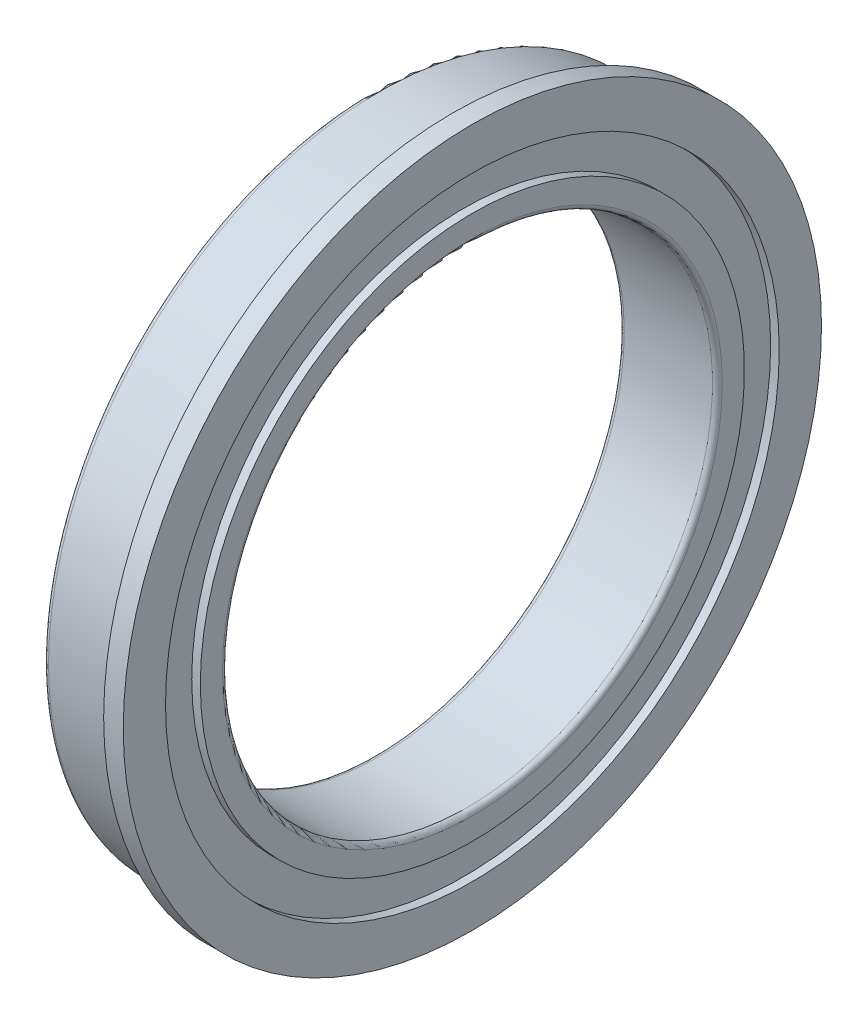
ISO-10303-21;
HEADER;
FILE_DESCRIPTION(('STEP AP214'),'2;1');
FILE_NAME('part.step','',(''),(''),'','','');
FILE_SCHEMA(('AUTOMOTIVE_DESIGN { 1 0 10303 214 1 1 1 1 }'));
ENDSEC;
DATA;
#1=APPLICATION_CONTEXT('core data for automotive mechanical design processes');
#2=APPLICATION_PROTOCOL_DEFINITION('international standard','automotive_design',2000,#1);
#3=PRODUCT_CONTEXT('',#1,'mechanical');
#4=PRODUCT('Part','Part','',(#3));
#5=PRODUCT_RELATED_PRODUCT_CATEGORY('part','',(#4));
#6=PRODUCT_DEFINITION_FORMATION('','',#4);
#7=PRODUCT_DEFINITION_CONTEXT('part definition',#1,'design');
#8=PRODUCT_DEFINITION('design','',#6,#7);
#9=PRODUCT_DEFINITION_SHAPE('','',#8);
#10=(LENGTH_UNIT() NAMED_UNIT(*) SI_UNIT(.MILLI.,.METRE.));
#11=(NAMED_UNIT(*) PLANE_ANGLE_UNIT() SI_UNIT($,.RADIAN.));
#12=(NAMED_UNIT(*) SI_UNIT($,.STERADIAN.) SOLID_ANGLE_UNIT());
#13=UNCERTAINTY_MEASURE_WITH_UNIT(LENGTH_MEASURE(1.E-05),#10,'distance_accuracy_value','');
#14=(GEOMETRIC_REPRESENTATION_CONTEXT(3) GLOBAL_UNCERTAINTY_ASSIGNED_CONTEXT((#13)) GLOBAL_UNIT_ASSIGNED_CONTEXT((#10,
#11,#12)) REPRESENTATION_CONTEXT('',''));
#15=CARTESIAN_POINT('',(0.,0.,0.));
#16=DIRECTION('',(0.,0.,1.));
#17=DIRECTION('',(1.,0.,0.));
#18=AXIS2_PLACEMENT_3D('',#15,#16,#17);
#19=CARTESIAN_POINT('',(-3.2,0.,0.));
#20=DIRECTION('',(-1.,0.,0.));
#21=DIRECTION('',(0.,0.,1.));
#22=AXIS2_PLACEMENT_3D('',#19,#20,#21);
#23=CYLINDRICAL_SURFACE('',#22,14.25);
#24=CARTESIAN_POINT('',(0.,0.,0.));
#25=DIRECTION('',(-1.,0.,0.));
#26=DIRECTION('',(0.,0.,1.));
#27=AXIS2_PLACEMENT_3D('',#24,#25,#26);
#28=CIRCLE('',#27,14.25);
#29=CARTESIAN_POINT('',(0.,0.,14.25));
#30=VERTEX_POINT('',#29);
#31=EDGE_CURVE('E69',#30,#30,#28,.T.);
#32=ORIENTED_EDGE('',*,*,#31,.F.);
#33=EDGE_LOOP('',(#32));
#34=FACE_BOUND('',#33,.T.);
#35=CARTESIAN_POINT('',(0.799999999999999,0.,0.));
#36=DIRECTION('',(-1.,0.,0.));
#37=DIRECTION('',(0.,0.,1.));
#38=AXIS2_PLACEMENT_3D('',#35,#36,#37);
#39=CIRCLE('',#38,14.25);
#40=CARTESIAN_POINT('',(0.799999999999999,0.,14.25));
#41=VERTEX_POINT('',#40);
#42=EDGE_CURVE('E113',#41,#41,#39,.T.);
#43=ORIENTED_EDGE('',*,*,#42,.T.);
#44=EDGE_LOOP('',(#43));
#45=FACE_BOUND('',#44,.T.);
#46=ADVANCED_FACE('F37',(#34,#45),#23,.T.);
#47=CARTESIAN_POINT('',(0.,13.7,0.));
#48=DIRECTION('',(1.,0.,0.));
#49=DIRECTION('',(0.,0.,-1.));
#50=AXIS2_PLACEMENT_3D('',#47,#48,#49);
#51=PLANE('',#50);
#52=CARTESIAN_POINT('',(0.,0.,0.));
#53=DIRECTION('',(-1.,0.,0.));
#54=DIRECTION('',(0.,0.,1.));
#55=AXIS2_PLACEMENT_3D('',#52,#53,#54);
#56=CIRCLE('',#55,13.7);
#57=CARTESIAN_POINT('',(0.,0.,13.7));
#58=VERTEX_POINT('',#57);
#59=EDGE_CURVE('E73',#58,#58,#56,.T.);
#60=ORIENTED_EDGE('',*,*,#59,.F.);
#61=EDGE_LOOP('',(#60));
#62=FACE_BOUND('',#61,.T.);
#63=ORIENTED_EDGE('',*,*,#31,.T.);
#64=EDGE_LOOP('',(#63));
#65=FACE_BOUND('',#64,.T.);
#66=ADVANCED_FACE('F156',(#62,#65),#51,.F.);
#67=CARTESIAN_POINT('',(0.,0.,0.));
#68=DIRECTION('',(-1.,0.,0.));
#69=DIRECTION('',(0.,0.,1.));
#70=AXIS2_PLACEMENT_3D('',#67,#68,#69);
#71=TOROIDAL_SURFACE('',#70,13.5,0.2);
#72=CARTESIAN_POINT('',(-0.2,0.,0.));
#73=DIRECTION('',(-1.,0.,0.));
#74=DIRECTION('',(0.,0.,1.));
#75=AXIS2_PLACEMENT_3D('',#72,#73,#74);
#76=CIRCLE('',#75,13.5);
#77=CARTESIAN_POINT('',(-0.2,0.,13.5));
#78=VERTEX_POINT('',#77);
#79=EDGE_CURVE('E77',#78,#78,#76,.T.);
#80=ORIENTED_EDGE('',*,*,#79,.F.);
#81=EDGE_LOOP('',(#80));
#82=FACE_BOUND('',#81,.T.);
#83=ORIENTED_EDGE('',*,*,#59,.T.);
#84=EDGE_LOOP('',(#83));
#85=FACE_BOUND('',#84,.T.);
#86=ADVANCED_FACE('F162',(#82,#85),#71,.F.);
#87=CARTESIAN_POINT('',(-3.2,0.,0.));
#88=DIRECTION('',(-1.,0.,0.));
#89=DIRECTION('',(0.,0.,1.));
#90=AXIS2_PLACEMENT_3D('',#87,#88,#89);
#91=CYLINDRICAL_SURFACE('',#90,13.5);
#92=CARTESIAN_POINT('',(-3.,0.,0.));
#93=DIRECTION('',(1.,0.,0.));
#94=DIRECTION('',(0.,0.,-1.));
#95=AXIS2_PLACEMENT_3D('',#92,#93,#94);
#96=CIRCLE('',#95,13.5);
#97=CARTESIAN_POINT('',(-3.,0.,-13.5));
#98=VERTEX_POINT('',#97);
#99=EDGE_CURVE('E10',#98,#98,#96,.T.);
#100=ORIENTED_EDGE('',*,*,#99,.T.);
#101=EDGE_LOOP('',(#100));
#102=FACE_BOUND('',#101,.T.);
#103=ORIENTED_EDGE('',*,*,#79,.T.);
#104=EDGE_LOOP('',(#103));
#105=FACE_BOUND('',#104,.T.);
#106=ADVANCED_FACE('F207',(#102,#105),#91,.T.);
#107=CARTESIAN_POINT('',(-3.2,12.525,0.));
#108=DIRECTION('',(1.,0.,0.));
#109=DIRECTION('',(0.,0.,-1.));
#110=AXIS2_PLACEMENT_3D('',#107,#108,#109);
#111=PLANE('',#110);
#112=CARTESIAN_POINT('',(-3.2,0.,0.));
#113=DIRECTION('',(1.,0.,0.));
#114=DIRECTION('',(0.,0.,-1.));
#115=AXIS2_PLACEMENT_3D('',#112,#113,#114);
#116=CIRCLE('',#115,13.3);
#117=CARTESIAN_POINT('',(-3.2,0.,-13.3));
#118=VERTEX_POINT('',#117);
#119=EDGE_CURVE('E45',#118,#118,#116,.F.);
#120=ORIENTED_EDGE('',*,*,#119,.T.);
#121=EDGE_LOOP('',(#120));
#122=FACE_BOUND('',#121,.T.);
#123=CARTESIAN_POINT('',(-3.2,0.,0.));
#124=DIRECTION('',(-1.,0.,0.));
#125=DIRECTION('',(0.,0.,1.));
#126=AXIS2_PLACEMENT_3D('',#123,#124,#125);
#127=CIRCLE('',#126,12.525);
#128=CARTESIAN_POINT('',(-3.2,0.,12.525));
#129=VERTEX_POINT('',#128);
#130=EDGE_CURVE('E81',#129,#129,#127,.T.);
#131=ORIENTED_EDGE('',*,*,#130,.F.);
#132=EDGE_LOOP('',(#131));
#133=FACE_BOUND('',#132,.T.);
#134=ADVANCED_FACE('F202',(#122,#133),#111,.F.);
#135=CARTESIAN_POINT('',(-3.2,0.,0.));
#136=DIRECTION('',(-1.,0.,0.));
#137=DIRECTION('',(0.,0.,1.));
#138=AXIS2_PLACEMENT_3D('',#135,#136,#137);
#139=CYLINDRICAL_SURFACE('',#138,12.525);
#140=CARTESIAN_POINT('',(-2.85,0.,0.));
#141=DIRECTION('',(-1.,0.,0.));
#142=DIRECTION('',(0.,0.,1.));
#143=AXIS2_PLACEMENT_3D('',#140,#141,#142);
#144=CIRCLE('',#143,12.525);
#145=CARTESIAN_POINT('',(-2.85,0.,12.525));
#146=VERTEX_POINT('',#145);
#147=EDGE_CURVE('E85',#146,#146,#144,.T.);
#148=ORIENTED_EDGE('',*,*,#147,.F.);
#149=EDGE_LOOP('',(#148));
#150=FACE_BOUND('',#149,.T.);
#151=ORIENTED_EDGE('',*,*,#130,.T.);
#152=EDGE_LOOP('',(#151));
#153=FACE_BOUND('',#152,.T.);
#154=ADVANCED_FACE('F196',(#150,#153),#139,.F.);
#155=CARTESIAN_POINT('',(-2.85,12.525,0.));
#156=DIRECTION('',(1.,0.,0.));
#157=DIRECTION('',(0.,0.,-1.));
#158=AXIS2_PLACEMENT_3D('',#155,#156,#157);
#159=PLANE('',#158);
#160=CARTESIAN_POINT('',(-2.85,0.,0.));
#161=DIRECTION('',(-1.,0.,0.));
#162=DIRECTION('',(0.,0.,1.));
#163=AXIS2_PLACEMENT_3D('',#160,#161,#162);
#164=CIRCLE('',#163,11.105);
#165=CARTESIAN_POINT('',(-2.85,0.,11.105));
#166=VERTEX_POINT('',#165);
#167=EDGE_CURVE('E89',#166,#166,#164,.T.);
#168=ORIENTED_EDGE('',*,*,#167,.F.);
#169=EDGE_LOOP('',(#168));
#170=FACE_BOUND('',#169,.T.);
#171=ORIENTED_EDGE('',*,*,#147,.T.);
#172=EDGE_LOOP('',(#171));
#173=FACE_BOUND('',#172,.T.);
#174=ADVANCED_FACE('F190',(#170,#173),#159,.F.);
#175=CARTESIAN_POINT('',(-3.2,0.,0.));
#176=DIRECTION('',(-1.,0.,0.));
#177=DIRECTION('',(0.,0.,1.));
#178=AXIS2_PLACEMENT_3D('',#175,#176,#177);
#179=CYLINDRICAL_SURFACE('',#178,11.105);
#180=CARTESIAN_POINT('',(-3.2,0.,0.));
#181=DIRECTION('',(-1.,0.,0.));
#182=DIRECTION('',(0.,0.,1.));
#183=AXIS2_PLACEMENT_3D('',#180,#181,#182);
#184=CIRCLE('',#183,11.105);
#185=CARTESIAN_POINT('',(-3.2,0.,11.105));
#186=VERTEX_POINT('',#185);
#187=EDGE_CURVE('E93',#186,#186,#184,.T.);
#188=ORIENTED_EDGE('',*,*,#187,.F.);
#189=EDGE_LOOP('',(#188));
#190=FACE_BOUND('',#189,.T.);
#191=ORIENTED_EDGE('',*,*,#167,.T.);
#192=EDGE_LOOP('',(#191));
#193=FACE_BOUND('',#192,.T.);
#194=ADVANCED_FACE('F184',(#190,#193),#179,.T.);
#195=CARTESIAN_POINT('',(-3.2,10.,0.));
#196=DIRECTION('',(1.,0.,0.));
#197=DIRECTION('',(0.,0.,-1.));
#198=AXIS2_PLACEMENT_3D('',#195,#196,#197);
#199=PLANE('',#198);
#200=CARTESIAN_POINT('',(-3.2,0.,0.));
#201=DIRECTION('',(1.,0.,0.));
#202=DIRECTION('',(0.,0.,-1.));
#203=AXIS2_PLACEMENT_3D('',#200,#201,#202);
#204=CIRCLE('',#203,10.2);
#205=CARTESIAN_POINT('',(-3.2,0.,-10.2));
#206=VERTEX_POINT('',#205);
#207=EDGE_CURVE('E50',#206,#206,#204,.T.);
#208=ORIENTED_EDGE('',*,*,#207,.T.);
#209=EDGE_LOOP('',(#208));
#210=FACE_BOUND('',#209,.T.);
#211=ORIENTED_EDGE('',*,*,#187,.T.);
#212=EDGE_LOOP('',(#211));
#213=FACE_BOUND('',#212,.T.);
#214=ADVANCED_FACE('F152',(#210,#213),#199,.F.);
#215=CARTESIAN_POINT('',(-3.2,0.,0.));
#216=DIRECTION('',(-1.,0.,0.));
#217=DIRECTION('',(0.,0.,1.));
#218=AXIS2_PLACEMENT_3D('',#215,#216,#217);
#219=CYLINDRICAL_SURFACE('',#218,10.);
#220=CARTESIAN_POINT('',(0.6,0.,0.));
#221=DIRECTION('',(-1.,0.,0.));
#222=DIRECTION('',(0.,0.,1.));
#223=AXIS2_PLACEMENT_3D('',#220,#221,#222);
#224=CIRCLE('',#223,10.);
#225=CARTESIAN_POINT('',(0.6,0.,10.));
#226=VERTEX_POINT('',#225);
#227=EDGE_CURVE('E55',#226,#226,#224,.F.);
#228=ORIENTED_EDGE('',*,*,#227,.T.);
#229=EDGE_LOOP('',(#228));
#230=FACE_BOUND('',#229,.T.);
#231=CARTESIAN_POINT('',(-3.,0.,0.));
#232=DIRECTION('',(1.,0.,0.));
#233=DIRECTION('',(0.,0.,-1.));
#234=AXIS2_PLACEMENT_3D('',#231,#232,#233);
#235=CIRCLE('',#234,10.);
#236=CARTESIAN_POINT('',(-3.,0.,-10.));
#237=VERTEX_POINT('',#236);
#238=EDGE_CURVE('E61',#237,#237,#235,.F.);
#239=ORIENTED_EDGE('',*,*,#238,.T.);
#240=EDGE_LOOP('',(#239));
#241=FACE_BOUND('',#240,.T.);
#242=ADVANCED_FACE('F146',(#230,#241),#219,.F.);
#243=CARTESIAN_POINT('',(0.8,11.105,0.));
#244=DIRECTION('',(-1.,0.,0.));
#245=DIRECTION('',(0.,0.,1.));
#246=AXIS2_PLACEMENT_3D('',#243,#244,#245);
#247=PLANE('',#246);
#248=CARTESIAN_POINT('',(0.8,0.,0.));
#249=DIRECTION('',(-1.,0.,0.));
#250=DIRECTION('',(0.,0.,1.));
#251=AXIS2_PLACEMENT_3D('',#248,#249,#250);
#252=CIRCLE('',#251,10.2);
#253=CARTESIAN_POINT('',(0.8,0.,10.2));
#254=VERTEX_POINT('',#253);
#255=EDGE_CURVE('E65',#254,#254,#252,.T.);
#256=ORIENTED_EDGE('',*,*,#255,.T.);
#257=EDGE_LOOP('',(#256));
#258=FACE_BOUND('',#257,.T.);
#259=CARTESIAN_POINT('',(0.8,0.,0.));
#260=DIRECTION('',(-1.,0.,0.));
#261=DIRECTION('',(0.,0.,1.));
#262=AXIS2_PLACEMENT_3D('',#259,#260,#261);
#263=CIRCLE('',#262,11.105);
#264=CARTESIAN_POINT('',(0.8,0.,11.105));
#265=VERTEX_POINT('',#264);
#266=EDGE_CURVE('E97',#265,#265,#263,.T.);
#267=ORIENTED_EDGE('',*,*,#266,.F.);
#268=EDGE_LOOP('',(#267));
#269=FACE_BOUND('',#268,.T.);
#270=ADVANCED_FACE('F141',(#258,#269),#247,.F.);
#271=CARTESIAN_POINT('',(-3.2,0.,0.));
#272=DIRECTION('',(-1.,0.,0.));
#273=DIRECTION('',(0.,0.,1.));
#274=AXIS2_PLACEMENT_3D('',#271,#272,#273);
#275=CYLINDRICAL_SURFACE('',#274,11.105);
#276=CARTESIAN_POINT('',(0.449999999999999,0.,0.));
#277=DIRECTION('',(-1.,0.,0.));
#278=DIRECTION('',(0.,0.,1.));
#279=AXIS2_PLACEMENT_3D('',#276,#277,#278);
#280=CIRCLE('',#279,11.105);
#281=CARTESIAN_POINT('',(0.449999999999999,0.,11.105));
#282=VERTEX_POINT('',#281);
#283=EDGE_CURVE('E101',#282,#282,#280,.T.);
#284=ORIENTED_EDGE('',*,*,#283,.F.);
#285=EDGE_LOOP('',(#284));
#286=FACE_BOUND('',#285,.T.);
#287=ORIENTED_EDGE('',*,*,#266,.T.);
#288=EDGE_LOOP('',(#287));
#289=FACE_BOUND('',#288,.T.);
#290=ADVANCED_FACE('F135',(#286,#289),#275,.T.);
#291=CARTESIAN_POINT('',(0.449999999999999,12.525,0.));
#292=DIRECTION('',(-1.,0.,0.));
#293=DIRECTION('',(0.,0.,1.));
#294=AXIS2_PLACEMENT_3D('',#291,#292,#293);
#295=PLANE('',#294);
#296=CARTESIAN_POINT('',(0.449999999999999,0.,0.));
#297=DIRECTION('',(-1.,0.,0.));
#298=DIRECTION('',(0.,0.,1.));
#299=AXIS2_PLACEMENT_3D('',#296,#297,#298);
#300=CIRCLE('',#299,12.525);
#301=CARTESIAN_POINT('',(0.449999999999999,0.,12.525));
#302=VERTEX_POINT('',#301);
#303=EDGE_CURVE('E105',#302,#302,#300,.T.);
#304=ORIENTED_EDGE('',*,*,#303,.F.);
#305=EDGE_LOOP('',(#304));
#306=FACE_BOUND('',#305,.T.);
#307=ORIENTED_EDGE('',*,*,#283,.T.);
#308=EDGE_LOOP('',(#307));
#309=FACE_BOUND('',#308,.T.);
#310=ADVANCED_FACE('F129',(#306,#309),#295,.F.);
#311=CARTESIAN_POINT('',(-3.2,0.,0.));
#312=DIRECTION('',(-1.,0.,0.));
#313=DIRECTION('',(0.,0.,1.));
#314=AXIS2_PLACEMENT_3D('',#311,#312,#313);
#315=CYLINDRICAL_SURFACE('',#314,12.525);
#316=CARTESIAN_POINT('',(0.799999999999999,0.,0.));
#317=DIRECTION('',(-1.,0.,0.));
#318=DIRECTION('',(0.,0.,1.));
#319=AXIS2_PLACEMENT_3D('',#316,#317,#318);
#320=CIRCLE('',#319,12.525);
#321=CARTESIAN_POINT('',(0.799999999999999,0.,12.525));
#322=VERTEX_POINT('',#321);
#323=EDGE_CURVE('E109',#322,#322,#320,.T.);
#324=ORIENTED_EDGE('',*,*,#323,.F.);
#325=EDGE_LOOP('',(#324));
#326=FACE_BOUND('',#325,.T.);
#327=ORIENTED_EDGE('',*,*,#303,.T.);
#328=EDGE_LOOP('',(#327));
#329=FACE_BOUND('',#328,.T.);
#330=ADVANCED_FACE('F123',(#326,#329),#315,.F.);
#331=CARTESIAN_POINT('',(0.799999999999999,14.25,0.));
#332=DIRECTION('',(-1.,0.,0.));
#333=DIRECTION('',(0.,0.,1.));
#334=AXIS2_PLACEMENT_3D('',#331,#332,#333);
#335=PLANE('',#334);
#336=ORIENTED_EDGE('',*,*,#42,.F.);
#337=EDGE_LOOP('',(#336));
#338=FACE_BOUND('',#337,.T.);
#339=ORIENTED_EDGE('',*,*,#323,.T.);
#340=EDGE_LOOP('',(#339));
#341=FACE_BOUND('',#340,.T.);
#342=ADVANCED_FACE('F119',(#338,#341),#335,.F.);
#343=CARTESIAN_POINT('',(0.6,0.,0.));
#344=DIRECTION('',(-1.,0.,0.));
#345=DIRECTION('',(0.,0.,1.));
#346=AXIS2_PLACEMENT_3D('',#343,#344,#345);
#347=TOROIDAL_SURFACE('',#346,10.2,0.2);
#348=ORIENTED_EDGE('',*,*,#227,.F.);
#349=EDGE_LOOP('',(#348));
#350=FACE_BOUND('',#349,.T.);
#351=ORIENTED_EDGE('',*,*,#255,.F.);
#352=EDGE_LOOP('',(#351));
#353=FACE_BOUND('',#352,.T.);
#354=ADVANCED_FACE('F122',(#350,#353),#347,.T.);
#355=CARTESIAN_POINT('',(-3.,0.,0.));
#356=DIRECTION('',(1.,0.,0.));
#357=DIRECTION('',(0.,0.,-1.));
#358=AXIS2_PLACEMENT_3D('',#355,#356,#357);
#359=TOROIDAL_SURFACE('',#358,10.2,0.2);
#360=ORIENTED_EDGE('',*,*,#207,.F.);
#361=EDGE_LOOP('',(#360));
#362=FACE_BOUND('',#361,.T.);
#363=ORIENTED_EDGE('',*,*,#238,.F.);
#364=EDGE_LOOP('',(#363));
#365=FACE_BOUND('',#364,.T.);
#366=ADVANCED_FACE('F169',(#362,#365),#359,.T.);
#367=CARTESIAN_POINT('',(-3.,0.,0.));
#368=DIRECTION('',(1.,0.,0.));
#369=DIRECTION('',(0.,0.,-1.));
#370=AXIS2_PLACEMENT_3D('',#367,#368,#369);
#371=TOROIDAL_SURFACE('',#370,13.3,0.2);
#372=ORIENTED_EDGE('',*,*,#99,.F.);
#373=EDGE_LOOP('',(#372));
#374=FACE_BOUND('',#373,.T.);
#375=ORIENTED_EDGE('',*,*,#119,.F.);
#376=EDGE_LOOP('',(#375));
#377=FACE_BOUND('',#376,.T.);
#378=ADVANCED_FACE('F39',(#374,#377),#371,.T.);
#379=CLOSED_SHELL('',(#46,#66,#86,#106,#134,#154,#174,#194,#214,#242,#270,#290,#310,#330,#342,
#354,#366,#378));
#380=MANIFOLD_SOLID_BREP('B2',#379);
#381=ADVANCED_BREP_SHAPE_REPRESENTATION('',(#18,#380),#14);
#382=SHAPE_DEFINITION_REPRESENTATION(#9,#381);
ENDSEC;
END-ISO-10303-21;
